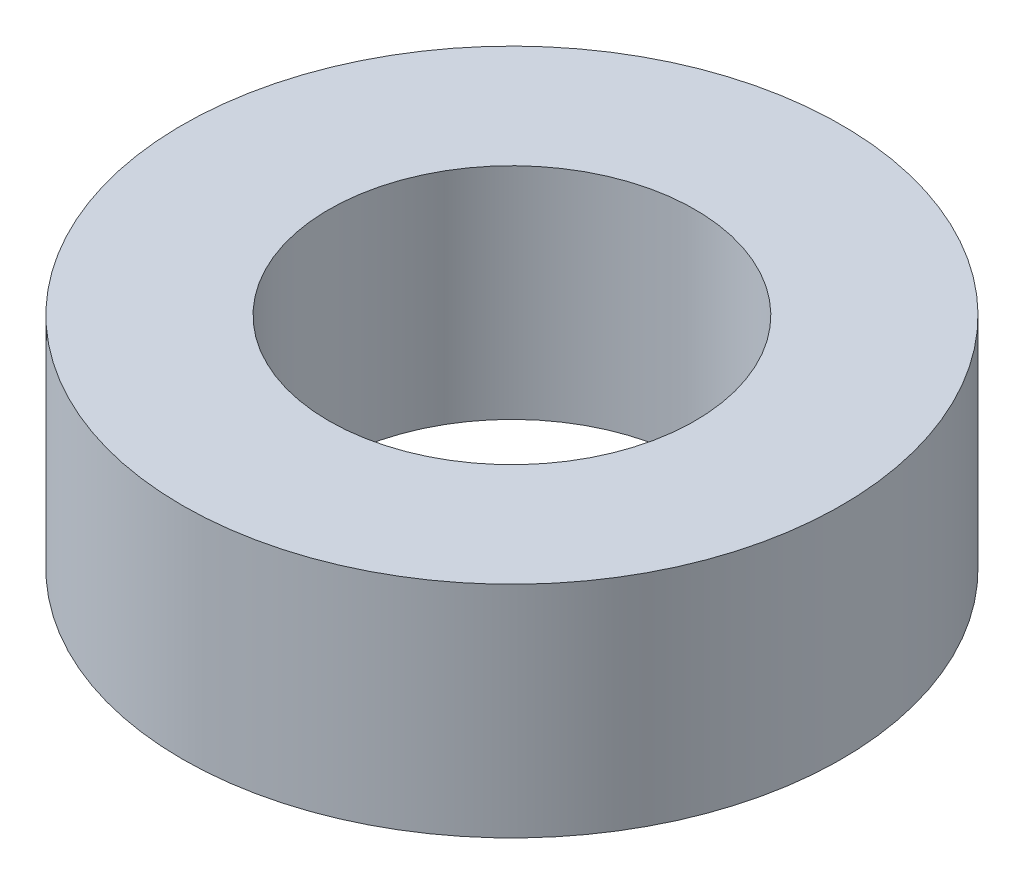
ISO-10303-21;
HEADER;
FILE_DESCRIPTION(('STEP AP214'),'2;1');
FILE_NAME('part.step','',(''),(''),'','','');
FILE_SCHEMA(('AUTOMOTIVE_DESIGN { 1 0 10303 214 1 1 1 1 }'));
ENDSEC;
DATA;
#1=APPLICATION_CONTEXT('core data for automotive mechanical design processes');
#2=APPLICATION_PROTOCOL_DEFINITION('international standard','automotive_design',2000,#1);
#3=PRODUCT_CONTEXT('',#1,'mechanical');
#4=PRODUCT('Part','Part','',(#3));
#5=PRODUCT_RELATED_PRODUCT_CATEGORY('part','',(#4));
#6=PRODUCT_DEFINITION_FORMATION('','',#4);
#7=PRODUCT_DEFINITION_CONTEXT('part definition',#1,'design');
#8=PRODUCT_DEFINITION('design','',#6,#7);
#9=PRODUCT_DEFINITION_SHAPE('','',#8);
#10=(LENGTH_UNIT() NAMED_UNIT(*) SI_UNIT(.MILLI.,.METRE.));
#11=(NAMED_UNIT(*) PLANE_ANGLE_UNIT() SI_UNIT($,.RADIAN.));
#12=(NAMED_UNIT(*) SI_UNIT($,.STERADIAN.) SOLID_ANGLE_UNIT());
#13=UNCERTAINTY_MEASURE_WITH_UNIT(LENGTH_MEASURE(1.E-05),#10,'distance_accuracy_value','');
#14=(GEOMETRIC_REPRESENTATION_CONTEXT(3) GLOBAL_UNCERTAINTY_ASSIGNED_CONTEXT((#13)) GLOBAL_UNIT_ASSIGNED_CONTEXT((#10,
#11,#12)) REPRESENTATION_CONTEXT('',''));
#15=CARTESIAN_POINT('',(0.,0.,0.));
#16=DIRECTION('',(0.,0.,1.));
#17=DIRECTION('',(1.,0.,0.));
#18=AXIS2_PLACEMENT_3D('',#15,#16,#17);
#19=CARTESIAN_POINT('',(0.,3.,0.));
#20=DIRECTION('',(0.,1.,0.));
#21=DIRECTION('',(0.,0.,1.));
#22=AXIS2_PLACEMENT_3D('',#19,#20,#21);
#23=PLANE('',#22);
#24=CARTESIAN_POINT('',(0.,3.,0.));
#25=DIRECTION('',(0.,1.,0.));
#26=DIRECTION('',(0.,0.,1.));
#27=AXIS2_PLACEMENT_3D('',#24,#25,#26);
#28=CIRCLE('',#27,9.);
#29=CARTESIAN_POINT('',(0.,3.,9.));
#30=VERTEX_POINT('',#29);
#31=EDGE_CURVE('E10',#30,#30,#28,.T.);
#32=ORIENTED_EDGE('',*,*,#31,.T.);
#33=EDGE_LOOP('',(#32));
#34=FACE_BOUND('',#33,.T.);
#35=CARTESIAN_POINT('',(0.,3.,0.));
#36=DIRECTION('',(0.,1.,0.));
#37=DIRECTION('',(0.,0.,1.));
#38=AXIS2_PLACEMENT_3D('',#35,#36,#37);
#39=CIRCLE('',#38,5.);
#40=CARTESIAN_POINT('',(0.,3.,5.));
#41=VERTEX_POINT('',#40);
#42=EDGE_CURVE('E42',#41,#41,#39,.T.);
#43=ORIENTED_EDGE('',*,*,#42,.F.);
#44=EDGE_LOOP('',(#43));
#45=FACE_BOUND('',#44,.T.);
#46=ADVANCED_FACE('F31',(#34,#45),#23,.T.);
#47=CARTESIAN_POINT('',(0.,-3.,0.));
#48=DIRECTION('',(0.,1.,0.));
#49=DIRECTION('',(0.,0.,1.));
#50=AXIS2_PLACEMENT_3D('',#47,#48,#49);
#51=PLANE('',#50);
#52=CARTESIAN_POINT('',(0.,-3.,0.));
#53=DIRECTION('',(0.,1.,0.));
#54=DIRECTION('',(0.,0.,1.));
#55=AXIS2_PLACEMENT_3D('',#52,#53,#54);
#56=CIRCLE('',#55,9.);
#57=CARTESIAN_POINT('',(0.,-3.,9.));
#58=VERTEX_POINT('',#57);
#59=EDGE_CURVE('E35',#58,#58,#56,.T.);
#60=ORIENTED_EDGE('',*,*,#59,.F.);
#61=EDGE_LOOP('',(#60));
#62=FACE_BOUND('',#61,.T.);
#63=CARTESIAN_POINT('',(0.,-3.,0.));
#64=DIRECTION('',(0.,1.,0.));
#65=DIRECTION('',(0.,0.,1.));
#66=AXIS2_PLACEMENT_3D('',#63,#64,#65);
#67=CIRCLE('',#66,5.);
#68=CARTESIAN_POINT('',(0.,-3.,5.));
#69=VERTEX_POINT('',#68);
#70=EDGE_CURVE('E44',#69,#69,#67,.T.);
#71=ORIENTED_EDGE('',*,*,#70,.T.);
#72=EDGE_LOOP('',(#71));
#73=FACE_BOUND('',#72,.T.);
#74=ADVANCED_FACE('F54',(#62,#73),#51,.F.);
#75=CARTESIAN_POINT('',(0.,3.,0.));
#76=DIRECTION('',(0.,-1.,0.));
#77=DIRECTION('',(0.,0.,-1.));
#78=AXIS2_PLACEMENT_3D('',#75,#76,#77);
#79=CYLINDRICAL_SURFACE('',#78,9.);
#80=ORIENTED_EDGE('',*,*,#31,.F.);
#81=EDGE_LOOP('',(#80));
#82=FACE_BOUND('',#81,.T.);
#83=ORIENTED_EDGE('',*,*,#59,.T.);
#84=EDGE_LOOP('',(#83));
#85=FACE_BOUND('',#84,.T.);
#86=ADVANCED_FACE('F33',(#82,#85),#79,.T.);
#87=CARTESIAN_POINT('',(0.,3.,0.));
#88=DIRECTION('',(0.,-1.,0.));
#89=DIRECTION('',(0.,0.,-1.));
#90=AXIS2_PLACEMENT_3D('',#87,#88,#89);
#91=CYLINDRICAL_SURFACE('',#90,5.);
#92=ORIENTED_EDGE('',*,*,#42,.T.);
#93=EDGE_LOOP('',(#92));
#94=FACE_BOUND('',#93,.T.);
#95=ORIENTED_EDGE('',*,*,#70,.F.);
#96=EDGE_LOOP('',(#95));
#97=FACE_BOUND('',#96,.T.);
#98=ADVANCED_FACE('F50',(#94,#97),#91,.F.);
#99=CLOSED_SHELL('',(#46,#74,#86,#98));
#100=MANIFOLD_SOLID_BREP('B2',#99);
#101=ADVANCED_BREP_SHAPE_REPRESENTATION('',(#18,#100),#14);
#102=SHAPE_DEFINITION_REPRESENTATION(#9,#101);
ENDSEC;
END-ISO-10303-21;
